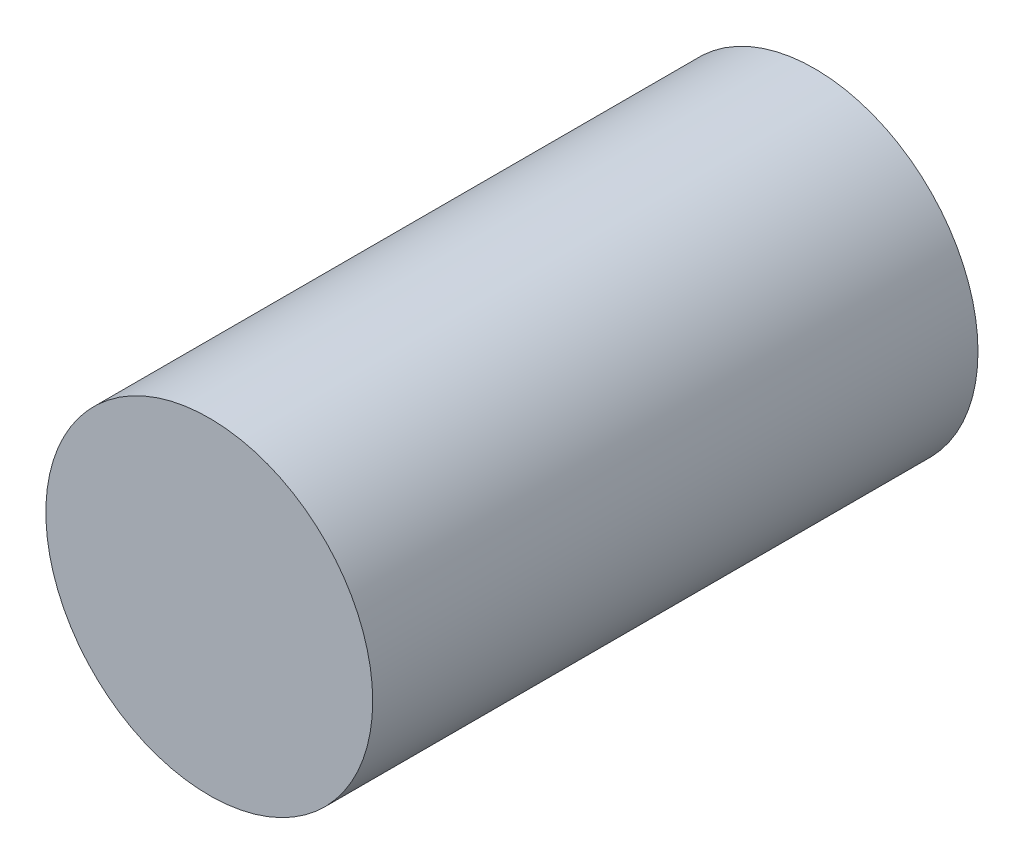
ISO-10303-21;
HEADER;
FILE_DESCRIPTION(('STEP AP214'),'2;1');
FILE_NAME('part.step','',(''),(''),'','','');
FILE_SCHEMA(('AUTOMOTIVE_DESIGN { 1 0 10303 214 1 1 1 1 }'));
ENDSEC;
DATA;
#1=APPLICATION_CONTEXT('core data for automotive mechanical design processes');
#2=APPLICATION_PROTOCOL_DEFINITION('international standard','automotive_design',2000,#1);
#3=PRODUCT_CONTEXT('',#1,'mechanical');
#4=PRODUCT('Part','Part','',(#3));
#5=PRODUCT_RELATED_PRODUCT_CATEGORY('part','',(#4));
#6=PRODUCT_DEFINITION_FORMATION('','',#4);
#7=PRODUCT_DEFINITION_CONTEXT('part definition',#1,'design');
#8=PRODUCT_DEFINITION('design','',#6,#7);
#9=PRODUCT_DEFINITION_SHAPE('','',#8);
#10=(LENGTH_UNIT() NAMED_UNIT(*) SI_UNIT(.MILLI.,.METRE.));
#11=(NAMED_UNIT(*) PLANE_ANGLE_UNIT() SI_UNIT($,.RADIAN.));
#12=(NAMED_UNIT(*) SI_UNIT($,.STERADIAN.) SOLID_ANGLE_UNIT());
#13=UNCERTAINTY_MEASURE_WITH_UNIT(LENGTH_MEASURE(1.E-05),#10,'distance_accuracy_value','');
#14=(GEOMETRIC_REPRESENTATION_CONTEXT(3) GLOBAL_UNCERTAINTY_ASSIGNED_CONTEXT((#13)) GLOBAL_UNIT_ASSIGNED_CONTEXT((#10,
#11,#12)) REPRESENTATION_CONTEXT('',''));
#15=CARTESIAN_POINT('',(0.,0.,0.));
#16=DIRECTION('',(0.,0.,1.));
#17=DIRECTION('',(1.,0.,0.));
#18=AXIS2_PLACEMENT_3D('',#15,#16,#17);
#19=CARTESIAN_POINT('',(0.,0.,50.));
#20=DIRECTION('',(0.,0.,-1.));
#21=DIRECTION('',(-1.,0.,0.));
#22=AXIS2_PLACEMENT_3D('',#19,#20,#21);
#23=CYLINDRICAL_SURFACE('',#22,13.5);
#24=CARTESIAN_POINT('',(0.,0.,50.));
#25=DIRECTION('',(0.,0.,1.));
#26=DIRECTION('',(1.,0.,0.));
#27=AXIS2_PLACEMENT_3D('',#24,#25,#26);
#28=CIRCLE('',#27,13.5);
#29=CARTESIAN_POINT('',(13.5,0.,50.));
#30=VERTEX_POINT('',#29);
#31=EDGE_CURVE('E10',#30,#30,#28,.T.);
#32=ORIENTED_EDGE('',*,*,#31,.F.);
#33=EDGE_LOOP('',(#32));
#34=FACE_BOUND('',#33,.T.);
#35=CARTESIAN_POINT('',(0.,0.,0.));
#36=DIRECTION('',(0.,0.,1.));
#37=DIRECTION('',(1.,0.,0.));
#38=AXIS2_PLACEMENT_3D('',#35,#36,#37);
#39=CIRCLE('',#38,13.5);
#40=CARTESIAN_POINT('',(13.5,0.,0.));
#41=VERTEX_POINT('',#40);
#42=EDGE_CURVE('E37',#41,#41,#39,.T.);
#43=ORIENTED_EDGE('',*,*,#42,.T.);
#44=EDGE_LOOP('',(#43));
#45=FACE_BOUND('',#44,.T.);
#46=ADVANCED_FACE('F40',(#34,#45),#23,.T.);
#47=CARTESIAN_POINT('',(0.,0.,50.));
#48=DIRECTION('',(0.,0.,1.));
#49=DIRECTION('',(1.,0.,0.));
#50=AXIS2_PLACEMENT_3D('',#47,#48,#49);
#51=PLANE('',#50);
#52=ORIENTED_EDGE('',*,*,#31,.T.);
#53=EDGE_LOOP('',(#52));
#54=FACE_BOUND('',#53,.T.);
#55=ADVANCED_FACE('F55',(#54),#51,.T.);
#56=CARTESIAN_POINT('',(0.,0.,0.));
#57=DIRECTION('',(0.,0.,1.));
#58=DIRECTION('',(1.,0.,0.));
#59=AXIS2_PLACEMENT_3D('',#56,#57,#58);
#60=PLANE('',#59);
#61=ORIENTED_EDGE('',*,*,#42,.F.);
#62=EDGE_LOOP('',(#61));
#63=FACE_BOUND('',#62,.T.);
#64=ADVANCED_FACE('F49',(#63),#60,.F.);
#65=CLOSED_SHELL('',(#46,#55,#64));
#66=MANIFOLD_SOLID_BREP('B2',#65);
#67=ADVANCED_BREP_SHAPE_REPRESENTATION('',(#18,#66),#14);
#68=SHAPE_DEFINITION_REPRESENTATION(#9,#67);
ENDSEC;
END-ISO-10303-21;
